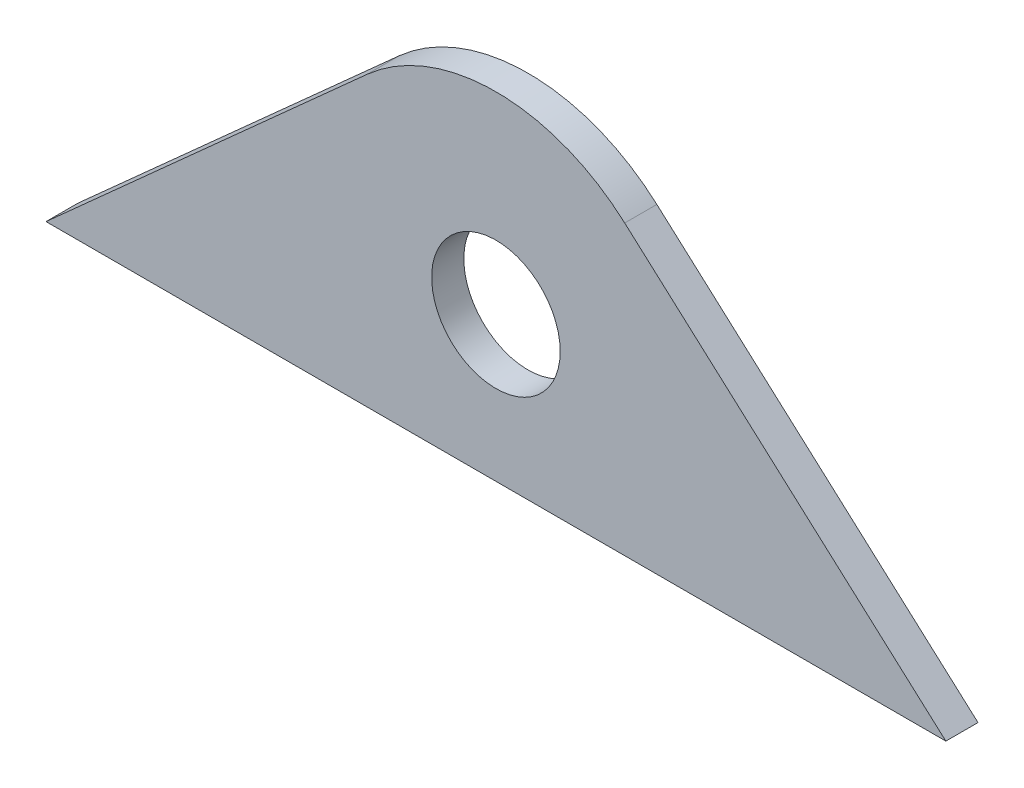
ISO-10303-21;
HEADER;
FILE_DESCRIPTION(('STEP AP214'),'2;1');
FILE_NAME('part.step','',(''),(''),'','','');
FILE_SCHEMA(('AUTOMOTIVE_DESIGN { 1 0 10303 214 1 1 1 1 }'));
ENDSEC;
DATA;
#1=APPLICATION_CONTEXT('core data for automotive mechanical design processes');
#2=APPLICATION_PROTOCOL_DEFINITION('international standard','automotive_design',2000,#1);
#3=PRODUCT_CONTEXT('',#1,'mechanical');
#4=PRODUCT('Part','Part','',(#3));
#5=PRODUCT_RELATED_PRODUCT_CATEGORY('part','',(#4));
#6=PRODUCT_DEFINITION_FORMATION('','',#4);
#7=PRODUCT_DEFINITION_CONTEXT('part definition',#1,'design');
#8=PRODUCT_DEFINITION('design','',#6,#7);
#9=PRODUCT_DEFINITION_SHAPE('','',#8);
#10=(LENGTH_UNIT() NAMED_UNIT(*) SI_UNIT(.MILLI.,.METRE.));
#11=(NAMED_UNIT(*) PLANE_ANGLE_UNIT() SI_UNIT($,.RADIAN.));
#12=(NAMED_UNIT(*) SI_UNIT($,.STERADIAN.) SOLID_ANGLE_UNIT());
#13=UNCERTAINTY_MEASURE_WITH_UNIT(LENGTH_MEASURE(1.E-05),#10,'distance_accuracy_value','');
#14=(GEOMETRIC_REPRESENTATION_CONTEXT(3) GLOBAL_UNCERTAINTY_ASSIGNED_CONTEXT((#13)) GLOBAL_UNIT_ASSIGNED_CONTEXT((#10,
#11,#12)) REPRESENTATION_CONTEXT('',''));
#15=CARTESIAN_POINT('',(0.,0.,0.));
#16=DIRECTION('',(0.,0.,1.));
#17=DIRECTION('',(1.,0.,0.));
#18=AXIS2_PLACEMENT_3D('',#15,#16,#17);
#19=CARTESIAN_POINT('',(0.,14.2875,3.175));
#20=DIRECTION('',(0.,0.,-1.));
#21=DIRECTION('',(-1.,0.,0.));
#22=AXIS2_PLACEMENT_3D('',#19,#20,#21);
#23=PLANE('',#22);
#24=CARTESIAN_POINT('',(0.,14.2875,3.175));
#25=DIRECTION('',(0.,0.,1.));
#26=DIRECTION('',(-1.,0.,0.));
#27=AXIS2_PLACEMENT_3D('',#24,#25,#26);
#28=CIRCLE('',#27,19.05);
#29=CARTESIAN_POINT('',(12.7219421161864,28.46687547258,3.175));
#30=VERTEX_POINT('',#29);
#31=CARTESIAN_POINT('',(-12.7219421161864,28.46687547258,3.175));
#32=VERTEX_POINT('',#31);
#33=EDGE_CURVE('E86',#30,#32,#28,.T.);
#34=ORIENTED_EDGE('',*,*,#33,.T.);
#35=DIRECTION('',(-0.744324171788974,-0.667818483789313,0.));
#36=VECTOR('',#35,1.);
#37=CARTESIAN_POINT('',(-12.7219421161864,28.46687547258,3.175));
#38=LINE('',#37,#36);
#39=CARTESIAN_POINT('',(-44.45,0.,3.175));
#40=VERTEX_POINT('',#39);
#41=EDGE_CURVE('E81',#32,#40,#38,.T.);
#42=ORIENTED_EDGE('',*,*,#41,.T.);
#43=DIRECTION('',(1.,0.,0.));
#44=VECTOR('',#43,1.);
#45=CARTESIAN_POINT('',(-44.45,0.,3.175));
#46=LINE('',#45,#44);
#47=CARTESIAN_POINT('',(44.45,0.,3.175));
#48=VERTEX_POINT('',#47);
#49=EDGE_CURVE('E84',#40,#48,#46,.T.);
#50=ORIENTED_EDGE('',*,*,#49,.T.);
#51=DIRECTION('',(-0.744324171788974,0.667818483789313,0.));
#52=VECTOR('',#51,1.);
#53=CARTESIAN_POINT('',(44.45,0.,3.175));
#54=LINE('',#53,#52);
#55=EDGE_CURVE('E51',#48,#30,#54,.T.);
#56=ORIENTED_EDGE('',*,*,#55,.T.);
#57=EDGE_LOOP('',(#34,#42,#50,#56));
#58=FACE_BOUND('',#57,.T.);
#59=CARTESIAN_POINT('',(0.,14.2875,3.175));
#60=DIRECTION('',(0.,0.,1.));
#61=DIRECTION('',(1.,0.,0.));
#62=AXIS2_PLACEMENT_3D('',#59,#60,#61);
#63=CIRCLE('',#62,6.35);
#64=CARTESIAN_POINT('',(6.35,14.2875,3.175));
#65=VERTEX_POINT('',#64);
#66=EDGE_CURVE('E101',#65,#65,#63,.T.);
#67=ORIENTED_EDGE('',*,*,#66,.F.);
#68=EDGE_LOOP('',(#67));
#69=FACE_BOUND('',#68,.T.);
#70=ADVANCED_FACE('F34',(#58,#69),#23,.F.);
#71=CARTESIAN_POINT('',(0.,14.2875,0.));
#72=DIRECTION('',(0.,0.,-1.));
#73=DIRECTION('',(-1.,0.,0.));
#74=AXIS2_PLACEMENT_3D('',#71,#72,#73);
#75=PLANE('',#74);
#76=CARTESIAN_POINT('',(0.,14.2875,0.));
#77=DIRECTION('',(0.,0.,1.));
#78=DIRECTION('',(-1.,0.,0.));
#79=AXIS2_PLACEMENT_3D('',#76,#77,#78);
#80=CIRCLE('',#79,19.05);
#81=CARTESIAN_POINT('',(12.7219421161864,28.46687547258,0.));
#82=VERTEX_POINT('',#81);
#83=CARTESIAN_POINT('',(-12.7219421161864,28.46687547258,0.));
#84=VERTEX_POINT('',#83);
#85=EDGE_CURVE('E98',#82,#84,#80,.T.);
#86=ORIENTED_EDGE('',*,*,#85,.F.);
#87=DIRECTION('',(-0.744324171788974,0.667818483789313,0.));
#88=VECTOR('',#87,1.);
#89=CARTESIAN_POINT('',(44.45,0.,0.));
#90=LINE('',#89,#88);
#91=CARTESIAN_POINT('',(44.45,0.,0.));
#92=VERTEX_POINT('',#91);
#93=EDGE_CURVE('E74',#92,#82,#90,.T.);
#94=ORIENTED_EDGE('',*,*,#93,.F.);
#95=DIRECTION('',(1.,0.,0.));
#96=VECTOR('',#95,1.);
#97=CARTESIAN_POINT('',(-44.45,0.,0.));
#98=LINE('',#97,#96);
#99=CARTESIAN_POINT('',(-44.45,0.,0.));
#100=VERTEX_POINT('',#99);
#101=EDGE_CURVE('E68',#100,#92,#98,.T.);
#102=ORIENTED_EDGE('',*,*,#101,.F.);
#103=DIRECTION('',(-0.744324171788974,-0.667818483789313,0.));
#104=VECTOR('',#103,1.);
#105=CARTESIAN_POINT('',(-12.7219421161864,28.46687547258,0.));
#106=LINE('',#105,#104);
#107=EDGE_CURVE('E90',#84,#100,#106,.T.);
#108=ORIENTED_EDGE('',*,*,#107,.F.);
#109=EDGE_LOOP('',(#86,#94,#102,#108));
#110=FACE_BOUND('',#109,.T.);
#111=CARTESIAN_POINT('',(0.,14.2875,0.));
#112=DIRECTION('',(0.,0.,1.));
#113=DIRECTION('',(1.,0.,0.));
#114=AXIS2_PLACEMENT_3D('',#111,#112,#113);
#115=CIRCLE('',#114,6.35);
#116=CARTESIAN_POINT('',(6.35,14.2875,0.));
#117=VERTEX_POINT('',#116);
#118=EDGE_CURVE('E113',#117,#117,#115,.T.);
#119=ORIENTED_EDGE('',*,*,#118,.T.);
#120=EDGE_LOOP('',(#119));
#121=FACE_BOUND('',#120,.T.);
#122=ADVANCED_FACE('F109',(#110,#121),#75,.T.);
#123=CARTESIAN_POINT('',(0.,14.2875,3.175));
#124=DIRECTION('',(0.,0.,-1.));
#125=DIRECTION('',(-1.,0.,0.));
#126=AXIS2_PLACEMENT_3D('',#123,#124,#125);
#127=CYLINDRICAL_SURFACE('',#126,19.05);
#128=ORIENTED_EDGE('',*,*,#85,.T.);
#129=DIRECTION('',(0.,0.,-1.));
#130=VECTOR('',#129,1.);
#131=CARTESIAN_POINT('',(-12.7219421161864,28.46687547258,3.175));
#132=LINE('',#131,#130);
#133=EDGE_CURVE('E11',#32,#84,#132,.T.);
#134=ORIENTED_EDGE('',*,*,#133,.F.);
#135=ORIENTED_EDGE('',*,*,#33,.F.);
#136=DIRECTION('',(0.,0.,-1.));
#137=VECTOR('',#136,1.);
#138=CARTESIAN_POINT('',(12.7219421161864,28.46687547258,3.175));
#139=LINE('',#138,#137);
#140=EDGE_CURVE('E94',#30,#82,#139,.T.);
#141=ORIENTED_EDGE('',*,*,#140,.T.);
#142=EDGE_LOOP('',(#128,#134,#135,#141));
#143=FACE_BOUND('',#142,.T.);
#144=ADVANCED_FACE('F36',(#143),#127,.T.);
#145=CARTESIAN_POINT('',(-12.7219421161864,28.46687547258,3.175));
#146=DIRECTION('',(0.667818483789313,-0.744324171788974,0.));
#147=DIRECTION('',(0.744324171788974,0.667818483789313,0.));
#148=AXIS2_PLACEMENT_3D('',#145,#146,#147);
#149=PLANE('',#148);
#150=ORIENTED_EDGE('',*,*,#107,.T.);
#151=DIRECTION('',(0.,0.,-1.));
#152=VECTOR('',#151,1.);
#153=CARTESIAN_POINT('',(-44.45,0.,3.175));
#154=LINE('',#153,#152);
#155=EDGE_CURVE('E43',#40,#100,#154,.T.);
#156=ORIENTED_EDGE('',*,*,#155,.F.);
#157=ORIENTED_EDGE('',*,*,#41,.F.);
#158=ORIENTED_EDGE('',*,*,#133,.T.);
#159=EDGE_LOOP('',(#150,#156,#157,#158));
#160=FACE_BOUND('',#159,.T.);
#161=ADVANCED_FACE('F89',(#160),#149,.F.);
#162=CARTESIAN_POINT('',(-44.45,0.,3.175));
#163=DIRECTION('',(0.,1.,0.));
#164=DIRECTION('',(0.,0.,1.));
#165=AXIS2_PLACEMENT_3D('',#162,#163,#164);
#166=PLANE('',#165);
#167=ORIENTED_EDGE('',*,*,#101,.T.);
#168=DIRECTION('',(0.,0.,-1.));
#169=VECTOR('',#168,1.);
#170=CARTESIAN_POINT('',(44.45,0.,3.175));
#171=LINE('',#170,#169);
#172=EDGE_CURVE('E91',#48,#92,#171,.T.);
#173=ORIENTED_EDGE('',*,*,#172,.F.);
#174=ORIENTED_EDGE('',*,*,#49,.F.);
#175=ORIENTED_EDGE('',*,*,#155,.T.);
#176=EDGE_LOOP('',(#167,#173,#174,#175));
#177=FACE_BOUND('',#176,.T.);
#178=ADVANCED_FACE('F92',(#177),#166,.F.);
#179=CARTESIAN_POINT('',(44.45,0.,3.175));
#180=DIRECTION('',(-0.667818483789313,-0.744324171788974,0.));
#181=DIRECTION('',(0.744324171788974,-0.667818483789313,0.));
#182=AXIS2_PLACEMENT_3D('',#179,#180,#181);
#183=PLANE('',#182);
#184=ORIENTED_EDGE('',*,*,#93,.T.);
#185=ORIENTED_EDGE('',*,*,#140,.F.);
#186=ORIENTED_EDGE('',*,*,#55,.F.);
#187=ORIENTED_EDGE('',*,*,#172,.T.);
#188=EDGE_LOOP('',(#184,#185,#186,#187));
#189=FACE_BOUND('',#188,.T.);
#190=ADVANCED_FACE('F106',(#189),#183,.F.);
#191=CARTESIAN_POINT('',(0.,14.2875,3.175));
#192=DIRECTION('',(0.,0.,-1.));
#193=DIRECTION('',(-1.,0.,0.));
#194=AXIS2_PLACEMENT_3D('',#191,#192,#193);
#195=CYLINDRICAL_SURFACE('',#194,6.35);
#196=ORIENTED_EDGE('',*,*,#66,.T.);
#197=EDGE_LOOP('',(#196));
#198=FACE_BOUND('',#197,.T.);
#199=ORIENTED_EDGE('',*,*,#118,.F.);
#200=EDGE_LOOP('',(#199));
#201=FACE_BOUND('',#200,.T.);
#202=ADVANCED_FACE('F119',(#198,#201),#195,.F.);
#203=CLOSED_SHELL('',(#70,#122,#144,#161,#178,#190,#202));
#204=MANIFOLD_SOLID_BREP('B2',#203);
#205=ADVANCED_BREP_SHAPE_REPRESENTATION('',(#18,#204),#14);
#206=SHAPE_DEFINITION_REPRESENTATION(#9,#205);
ENDSEC;
END-ISO-10303-21;
